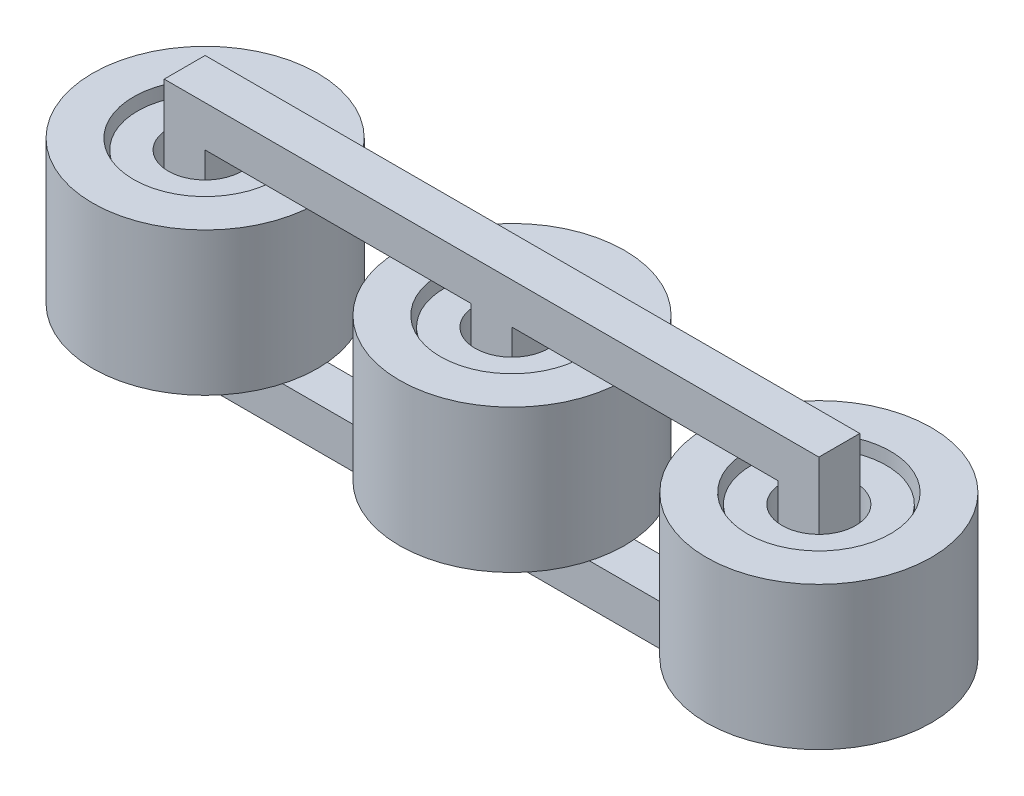
ISO-10303-21;
HEADER;
FILE_DESCRIPTION(('STEP AP214'),'2;1');
FILE_NAME('part.step','',(''),(''),'','','');
FILE_SCHEMA(('AUTOMOTIVE_DESIGN { 1 0 10303 214 1 1 1 1 }'));
ENDSEC;
DATA;
#1=APPLICATION_CONTEXT('core data for automotive mechanical design processes');
#2=APPLICATION_PROTOCOL_DEFINITION('international standard','automotive_design',2000,#1);
#3=PRODUCT_CONTEXT('',#1,'mechanical');
#4=PRODUCT('Part','Part','',(#3));
#5=PRODUCT_RELATED_PRODUCT_CATEGORY('part','',(#4));
#6=PRODUCT_DEFINITION_FORMATION('','',#4);
#7=PRODUCT_DEFINITION_CONTEXT('part definition',#1,'design');
#8=PRODUCT_DEFINITION('design','',#6,#7);
#9=PRODUCT_DEFINITION_SHAPE('','',#8);
#10=(LENGTH_UNIT() NAMED_UNIT(*) SI_UNIT(.MILLI.,.METRE.));
#11=(NAMED_UNIT(*) PLANE_ANGLE_UNIT() SI_UNIT($,.RADIAN.));
#12=(NAMED_UNIT(*) SI_UNIT($,.STERADIAN.) SOLID_ANGLE_UNIT());
#13=UNCERTAINTY_MEASURE_WITH_UNIT(LENGTH_MEASURE(1.E-05),#10,'distance_accuracy_value','');
#14=(GEOMETRIC_REPRESENTATION_CONTEXT(3) GLOBAL_UNCERTAINTY_ASSIGNED_CONTEXT((#13)) GLOBAL_UNIT_ASSIGNED_CONTEXT((#10,
#11,#12)) REPRESENTATION_CONTEXT('',''));
#15=CARTESIAN_POINT('',(0.,0.,0.));
#16=DIRECTION('',(0.,0.,1.));
#17=DIRECTION('',(1.,0.,0.));
#18=AXIS2_PLACEMENT_3D('',#15,#16,#17);
#19=CARTESIAN_POINT('',(1500.,717.900220009839,0.));
#20=DIRECTION('',(0.,1.,0.));
#21=DIRECTION('',(0.,0.,1.));
#22=AXIS2_PLACEMENT_3D('',#19,#20,#21);
#23=CYLINDRICAL_SURFACE('',#22,180.);
#24=CARTESIAN_POINT('',(1500.,-300.,0.));
#25=DIRECTION('',(0.,-1.,0.));
#26=DIRECTION('',(0.,0.,1.));
#27=AXIS2_PLACEMENT_3D('',#24,#25,#26);
#28=CIRCLE('',#27,180.);
#29=CARTESIAN_POINT('',(1500.,-300.,180.));
#30=VERTEX_POINT('',#29);
#31=EDGE_CURVE('E11',#30,#30,#28,.T.);
#32=ORIENTED_EDGE('',*,*,#31,.T.);
#33=EDGE_LOOP('',(#32));
#34=FACE_BOUND('',#33,.T.);
#35=CARTESIAN_POINT('',(1500.,300.,0.));
#36=DIRECTION('',(0.,-1.,0.));
#37=DIRECTION('',(0.,0.,1.));
#38=AXIS2_PLACEMENT_3D('',#35,#36,#37);
#39=CIRCLE('',#38,180.);
#40=CARTESIAN_POINT('',(1500.,300.,180.));
#41=VERTEX_POINT('',#40);
#42=EDGE_CURVE('E66',#41,#41,#39,.T.);
#43=ORIENTED_EDGE('',*,*,#42,.F.);
#44=EDGE_LOOP('',(#43));
#45=FACE_BOUND('',#44,.T.);
#46=ADVANCED_FACE('F52',(#34,#45),#23,.F.);
#47=CARTESIAN_POINT('',(1320.,-300.,0.));
#48=DIRECTION('',(0.,1.,0.));
#49=DIRECTION('',(0.,0.,1.));
#50=AXIS2_PLACEMENT_3D('',#47,#48,#49);
#51=PLANE('',#50);
#52=CARTESIAN_POINT('',(1500.,-300.,0.));
#53=DIRECTION('',(0.,-1.,0.));
#54=DIRECTION('',(0.,0.,1.));
#55=AXIS2_PLACEMENT_3D('',#52,#53,#54);
#56=CIRCLE('',#55,330.);
#57=CARTESIAN_POINT('',(1500.,-300.,330.));
#58=VERTEX_POINT('',#57);
#59=EDGE_CURVE('E58',#58,#58,#56,.T.);
#60=ORIENTED_EDGE('',*,*,#59,.T.);
#61=EDGE_LOOP('',(#60));
#62=FACE_BOUND('',#61,.T.);
#63=ORIENTED_EDGE('',*,*,#31,.F.);
#64=EDGE_LOOP('',(#63));
#65=FACE_BOUND('',#64,.T.);
#66=ADVANCED_FACE('F76',(#62,#65),#51,.F.);
#67=CARTESIAN_POINT('',(1500.,717.900220009839,0.));
#68=DIRECTION('',(0.,1.,0.));
#69=DIRECTION('',(0.,0.,1.));
#70=AXIS2_PLACEMENT_3D('',#67,#68,#69);
#71=CYLINDRICAL_SURFACE('',#70,330.);
#72=CARTESIAN_POINT('',(1500.,300.,0.));
#73=DIRECTION('',(0.,-1.,0.));
#74=DIRECTION('',(0.,0.,1.));
#75=AXIS2_PLACEMENT_3D('',#72,#73,#74);
#76=CIRCLE('',#75,330.);
#77=CARTESIAN_POINT('',(1500.,300.,330.));
#78=VERTEX_POINT('',#77);
#79=EDGE_CURVE('E62',#78,#78,#76,.T.);
#80=ORIENTED_EDGE('',*,*,#79,.T.);
#81=EDGE_LOOP('',(#80));
#82=FACE_BOUND('',#81,.T.);
#83=ORIENTED_EDGE('',*,*,#59,.F.);
#84=EDGE_LOOP('',(#83));
#85=FACE_BOUND('',#84,.T.);
#86=ADVANCED_FACE('F80',(#82,#85),#71,.T.);
#87=CARTESIAN_POINT('',(1320.,300.,0.));
#88=DIRECTION('',(0.,-1.,0.));
#89=DIRECTION('',(0.,0.,-1.));
#90=AXIS2_PLACEMENT_3D('',#87,#88,#89);
#91=PLANE('',#90);
#92=ORIENTED_EDGE('',*,*,#42,.T.);
#93=EDGE_LOOP('',(#92));
#94=FACE_BOUND('',#93,.T.);
#95=ORIENTED_EDGE('',*,*,#79,.F.);
#96=EDGE_LOOP('',(#95));
#97=FACE_BOUND('',#96,.T.);
#98=ADVANCED_FACE('F72',(#94,#97),#91,.F.);
#99=CLOSED_SHELL('',(#46,#66,#86,#98));
#100=MANIFOLD_SOLID_BREP('B2',#99);
#101=CARTESIAN_POINT('',(1500.,717.900220009839,0.));
#102=DIRECTION('',(0.,1.,0.));
#103=DIRECTION('',(0.,0.,1.));
#104=AXIS2_PLACEMENT_3D('',#101,#102,#103);
#105=CYLINDRICAL_SURFACE('',#104,350.);
#106=CARTESIAN_POINT('',(1500.,-350.,0.));
#107=DIRECTION('',(0.,-1.,0.));
#108=DIRECTION('',(0.,0.,1.));
#109=AXIS2_PLACEMENT_3D('',#106,#107,#108);
#110=CIRCLE('',#109,350.);
#111=CARTESIAN_POINT('',(1500.,-350.,350.));
#112=VERTEX_POINT('',#111);
#113=EDGE_CURVE('E51',#112,#112,#110,.T.);
#114=ORIENTED_EDGE('',*,*,#113,.T.);
#115=EDGE_LOOP('',(#114));
#116=FACE_BOUND('',#115,.T.);
#117=CARTESIAN_POINT('',(1500.,350.,0.));
#118=DIRECTION('',(0.,-1.,0.));
#119=DIRECTION('',(0.,0.,1.));
#120=AXIS2_PLACEMENT_3D('',#117,#118,#119);
#121=CIRCLE('',#120,350.);
#122=CARTESIAN_POINT('',(1500.,350.,350.));
#123=VERTEX_POINT('',#122);
#124=EDGE_CURVE('E160',#123,#123,#121,.T.);
#125=ORIENTED_EDGE('',*,*,#124,.F.);
#126=EDGE_LOOP('',(#125));
#127=FACE_BOUND('',#126,.T.);
#128=ADVANCED_FACE('F146',(#116,#127),#105,.F.);
#129=CARTESIAN_POINT('',(1150.,-350.,0.));
#130=DIRECTION('',(0.,1.,0.));
#131=DIRECTION('',(0.,0.,1.));
#132=AXIS2_PLACEMENT_3D('',#129,#130,#131);
#133=PLANE('',#132);
#134=CARTESIAN_POINT('',(1500.,-350.,0.));
#135=DIRECTION('',(0.,-1.,0.));
#136=DIRECTION('',(0.,0.,1.));
#137=AXIS2_PLACEMENT_3D('',#134,#135,#136);
#138=CIRCLE('',#137,550.);
#139=CARTESIAN_POINT('',(1500.,-350.,550.));
#140=VERTEX_POINT('',#139);
#141=EDGE_CURVE('E152',#140,#140,#138,.T.);
#142=ORIENTED_EDGE('',*,*,#141,.T.);
#143=EDGE_LOOP('',(#142));
#144=FACE_BOUND('',#143,.T.);
#145=ORIENTED_EDGE('',*,*,#113,.F.);
#146=EDGE_LOOP('',(#145));
#147=FACE_BOUND('',#146,.T.);
#148=ADVANCED_FACE('F170',(#144,#147),#133,.F.);
#149=CARTESIAN_POINT('',(1500.,717.900220009839,0.));
#150=DIRECTION('',(0.,1.,0.));
#151=DIRECTION('',(0.,0.,1.));
#152=AXIS2_PLACEMENT_3D('',#149,#150,#151);
#153=CYLINDRICAL_SURFACE('',#152,550.);
#154=CARTESIAN_POINT('',(1500.,350.,0.));
#155=DIRECTION('',(0.,-1.,0.));
#156=DIRECTION('',(0.,0.,1.));
#157=AXIS2_PLACEMENT_3D('',#154,#155,#156);
#158=CIRCLE('',#157,550.);
#159=CARTESIAN_POINT('',(1500.,350.,550.));
#160=VERTEX_POINT('',#159);
#161=EDGE_CURVE('E156',#160,#160,#158,.T.);
#162=ORIENTED_EDGE('',*,*,#161,.T.);
#163=EDGE_LOOP('',(#162));
#164=FACE_BOUND('',#163,.T.);
#165=ORIENTED_EDGE('',*,*,#141,.F.);
#166=EDGE_LOOP('',(#165));
#167=FACE_BOUND('',#166,.T.);
#168=ADVANCED_FACE('F174',(#164,#167),#153,.T.);
#169=CARTESIAN_POINT('',(1150.,350.,0.));
#170=DIRECTION('',(0.,-1.,0.));
#171=DIRECTION('',(0.,0.,-1.));
#172=AXIS2_PLACEMENT_3D('',#169,#170,#171);
#173=PLANE('',#172);
#174=ORIENTED_EDGE('',*,*,#124,.T.);
#175=EDGE_LOOP('',(#174));
#176=FACE_BOUND('',#175,.T.);
#177=ORIENTED_EDGE('',*,*,#161,.F.);
#178=EDGE_LOOP('',(#177));
#179=FACE_BOUND('',#178,.T.);
#180=ADVANCED_FACE('F166',(#176,#179),#173,.F.);
#181=CLOSED_SHELL('',(#128,#148,#168,#180));
#182=MANIFOLD_SOLID_BREP('B6',#181);
#183=CARTESIAN_POINT('',(-1500.,717.900220009839,0.));
#184=DIRECTION('',(0.,1.,0.));
#185=DIRECTION('',(0.,0.,1.));
#186=AXIS2_PLACEMENT_3D('',#183,#184,#185);
#187=CYLINDRICAL_SURFACE('',#186,350.);
#188=CARTESIAN_POINT('',(-1500.,-350.,0.));
#189=DIRECTION('',(0.,1.,0.));
#190=DIRECTION('',(0.,0.,1.));
#191=AXIS2_PLACEMENT_3D('',#188,#189,#190);
#192=CIRCLE('',#191,350.);
#193=CARTESIAN_POINT('',(-1500.,-350.,350.));
#194=VERTEX_POINT('',#193);
#195=EDGE_CURVE('E145',#194,#194,#192,.T.);
#196=ORIENTED_EDGE('',*,*,#195,.F.);
#197=EDGE_LOOP('',(#196));
#198=FACE_BOUND('',#197,.T.);
#199=CARTESIAN_POINT('',(-1500.,350.,0.));
#200=DIRECTION('',(0.,1.,0.));
#201=DIRECTION('',(0.,0.,1.));
#202=AXIS2_PLACEMENT_3D('',#199,#200,#201);
#203=CIRCLE('',#202,350.);
#204=CARTESIAN_POINT('',(-1500.,350.,350.));
#205=VERTEX_POINT('',#204);
#206=EDGE_CURVE('E254',#205,#205,#203,.T.);
#207=ORIENTED_EDGE('',*,*,#206,.T.);
#208=EDGE_LOOP('',(#207));
#209=FACE_BOUND('',#208,.T.);
#210=ADVANCED_FACE('F240',(#198,#209),#187,.F.);
#211=CARTESIAN_POINT('',(-1150.,-350.,0.));
#212=DIRECTION('',(0.,1.,0.));
#213=DIRECTION('',(0.,0.,1.));
#214=AXIS2_PLACEMENT_3D('',#211,#212,#213);
#215=PLANE('',#214);
#216=CARTESIAN_POINT('',(-1500.,-350.,0.));
#217=DIRECTION('',(0.,1.,0.));
#218=DIRECTION('',(0.,0.,1.));
#219=AXIS2_PLACEMENT_3D('',#216,#217,#218);
#220=CIRCLE('',#219,550.);
#221=CARTESIAN_POINT('',(-1500.,-350.,550.));
#222=VERTEX_POINT('',#221);
#223=EDGE_CURVE('E246',#222,#222,#220,.T.);
#224=ORIENTED_EDGE('',*,*,#223,.F.);
#225=EDGE_LOOP('',(#224));
#226=FACE_BOUND('',#225,.T.);
#227=ORIENTED_EDGE('',*,*,#195,.T.);
#228=EDGE_LOOP('',(#227));
#229=FACE_BOUND('',#228,.T.);
#230=ADVANCED_FACE('F269',(#226,#229),#215,.F.);
#231=CARTESIAN_POINT('',(-1500.,717.900220009839,0.));
#232=DIRECTION('',(0.,1.,0.));
#233=DIRECTION('',(0.,0.,1.));
#234=AXIS2_PLACEMENT_3D('',#231,#232,#233);
#235=CYLINDRICAL_SURFACE('',#234,550.);
#236=CARTESIAN_POINT('',(-1500.,350.,0.));
#237=DIRECTION('',(0.,1.,0.));
#238=DIRECTION('',(0.,0.,1.));
#239=AXIS2_PLACEMENT_3D('',#236,#237,#238);
#240=CIRCLE('',#239,550.);
#241=CARTESIAN_POINT('',(-1500.,350.,550.));
#242=VERTEX_POINT('',#241);
#243=EDGE_CURVE('E250',#242,#242,#240,.T.);
#244=ORIENTED_EDGE('',*,*,#243,.F.);
#245=EDGE_LOOP('',(#244));
#246=FACE_BOUND('',#245,.T.);
#247=ORIENTED_EDGE('',*,*,#223,.T.);
#248=EDGE_LOOP('',(#247));
#249=FACE_BOUND('',#248,.T.);
#250=ADVANCED_FACE('F264',(#246,#249),#235,.T.);
#251=CARTESIAN_POINT('',(-1150.,350.,0.));
#252=DIRECTION('',(0.,-1.,0.));
#253=DIRECTION('',(0.,0.,-1.));
#254=AXIS2_PLACEMENT_3D('',#251,#252,#253);
#255=PLANE('',#254);
#256=ORIENTED_EDGE('',*,*,#206,.F.);
#257=EDGE_LOOP('',(#256));
#258=FACE_BOUND('',#257,.T.);
#259=ORIENTED_EDGE('',*,*,#243,.T.);
#260=EDGE_LOOP('',(#259));
#261=FACE_BOUND('',#260,.T.);
#262=ADVANCED_FACE('F261',(#258,#261),#255,.F.);
#263=CLOSED_SHELL('',(#210,#230,#250,#262));
#264=MANIFOLD_SOLID_BREP('B46',#263);
#265=CARTESIAN_POINT('',(-1500.,717.900220009839,0.));
#266=DIRECTION('',(0.,1.,0.));
#267=DIRECTION('',(0.,0.,1.));
#268=AXIS2_PLACEMENT_3D('',#265,#266,#267);
#269=CYLINDRICAL_SURFACE('',#268,180.);
#270=CARTESIAN_POINT('',(-1500.,-300.,0.));
#271=DIRECTION('',(0.,1.,0.));
#272=DIRECTION('',(0.,0.,1.));
#273=AXIS2_PLACEMENT_3D('',#270,#271,#272);
#274=CIRCLE('',#273,180.);
#275=CARTESIAN_POINT('',(-1500.,-300.,180.));
#276=VERTEX_POINT('',#275);
#277=EDGE_CURVE('E239',#276,#276,#274,.T.);
#278=ORIENTED_EDGE('',*,*,#277,.F.);
#279=EDGE_LOOP('',(#278));
#280=FACE_BOUND('',#279,.T.);
#281=CARTESIAN_POINT('',(-1500.,300.,0.));
#282=DIRECTION('',(0.,1.,0.));
#283=DIRECTION('',(0.,0.,1.));
#284=AXIS2_PLACEMENT_3D('',#281,#282,#283);
#285=CIRCLE('',#284,180.);
#286=CARTESIAN_POINT('',(-1500.,300.,180.));
#287=VERTEX_POINT('',#286);
#288=EDGE_CURVE('E348',#287,#287,#285,.T.);
#289=ORIENTED_EDGE('',*,*,#288,.T.);
#290=EDGE_LOOP('',(#289));
#291=FACE_BOUND('',#290,.T.);
#292=ADVANCED_FACE('F334',(#280,#291),#269,.F.);
#293=CARTESIAN_POINT('',(-1320.,-300.,0.));
#294=DIRECTION('',(0.,1.,0.));
#295=DIRECTION('',(0.,0.,1.));
#296=AXIS2_PLACEMENT_3D('',#293,#294,#295);
#297=PLANE('',#296);
#298=CARTESIAN_POINT('',(-1500.,-300.,0.));
#299=DIRECTION('',(0.,1.,0.));
#300=DIRECTION('',(0.,0.,1.));
#301=AXIS2_PLACEMENT_3D('',#298,#299,#300);
#302=CIRCLE('',#301,330.);
#303=CARTESIAN_POINT('',(-1500.,-300.,330.));
#304=VERTEX_POINT('',#303);
#305=EDGE_CURVE('E340',#304,#304,#302,.T.);
#306=ORIENTED_EDGE('',*,*,#305,.F.);
#307=EDGE_LOOP('',(#306));
#308=FACE_BOUND('',#307,.T.);
#309=ORIENTED_EDGE('',*,*,#277,.T.);
#310=EDGE_LOOP('',(#309));
#311=FACE_BOUND('',#310,.T.);
#312=ADVANCED_FACE('F363',(#308,#311),#297,.F.);
#313=CARTESIAN_POINT('',(-1500.,717.900220009839,0.));
#314=DIRECTION('',(0.,1.,0.));
#315=DIRECTION('',(0.,0.,1.));
#316=AXIS2_PLACEMENT_3D('',#313,#314,#315);
#317=CYLINDRICAL_SURFACE('',#316,330.);
#318=CARTESIAN_POINT('',(-1500.,300.,0.));
#319=DIRECTION('',(0.,1.,0.));
#320=DIRECTION('',(0.,0.,1.));
#321=AXIS2_PLACEMENT_3D('',#318,#319,#320);
#322=CIRCLE('',#321,330.);
#323=CARTESIAN_POINT('',(-1500.,300.,330.));
#324=VERTEX_POINT('',#323);
#325=EDGE_CURVE('E344',#324,#324,#322,.T.);
#326=ORIENTED_EDGE('',*,*,#325,.F.);
#327=EDGE_LOOP('',(#326));
#328=FACE_BOUND('',#327,.T.);
#329=ORIENTED_EDGE('',*,*,#305,.T.);
#330=EDGE_LOOP('',(#329));
#331=FACE_BOUND('',#330,.T.);
#332=ADVANCED_FACE('F358',(#328,#331),#317,.T.);
#333=CARTESIAN_POINT('',(-1320.,300.,0.));
#334=DIRECTION('',(0.,-1.,0.));
#335=DIRECTION('',(0.,0.,-1.));
#336=AXIS2_PLACEMENT_3D('',#333,#334,#335);
#337=PLANE('',#336);
#338=ORIENTED_EDGE('',*,*,#288,.F.);
#339=EDGE_LOOP('',(#338));
#340=FACE_BOUND('',#339,.T.);
#341=ORIENTED_EDGE('',*,*,#325,.T.);
#342=EDGE_LOOP('',(#341));
#343=FACE_BOUND('',#342,.T.);
#344=ADVANCED_FACE('F355',(#340,#343),#337,.F.);
#345=CLOSED_SHELL('',(#292,#312,#332,#344));
#346=MANIFOLD_SOLID_BREP('B140',#345);
#347=CARTESIAN_POINT('',(0.,717.900220009839,0.));
#348=DIRECTION('',(0.,1.,0.));
#349=DIRECTION('',(0.,0.,1.));
#350=AXIS2_PLACEMENT_3D('',#347,#348,#349);
#351=CYLINDRICAL_SURFACE('',#350,350.);
#352=CARTESIAN_POINT('',(0.,-350.,0.));
#353=DIRECTION('',(0.,1.,0.));
#354=DIRECTION('',(0.,0.,1.));
#355=AXIS2_PLACEMENT_3D('',#352,#353,#354);
#356=CIRCLE('',#355,350.);
#357=CARTESIAN_POINT('',(0.,-350.,350.));
#358=VERTEX_POINT('',#357);
#359=EDGE_CURVE('E333',#358,#358,#356,.T.);
#360=ORIENTED_EDGE('',*,*,#359,.F.);
#361=EDGE_LOOP('',(#360));
#362=FACE_BOUND('',#361,.T.);
#363=CARTESIAN_POINT('',(0.,350.,0.));
#364=DIRECTION('',(0.,1.,0.));
#365=DIRECTION('',(0.,0.,1.));
#366=AXIS2_PLACEMENT_3D('',#363,#364,#365);
#367=CIRCLE('',#366,350.);
#368=CARTESIAN_POINT('',(0.,350.,350.));
#369=VERTEX_POINT('',#368);
#370=EDGE_CURVE('E442',#369,#369,#367,.T.);
#371=ORIENTED_EDGE('',*,*,#370,.T.);
#372=EDGE_LOOP('',(#371));
#373=FACE_BOUND('',#372,.T.);
#374=ADVANCED_FACE('F428',(#362,#373),#351,.F.);
#375=CARTESIAN_POINT('',(350.,-350.,0.));
#376=DIRECTION('',(0.,1.,0.));
#377=DIRECTION('',(0.,0.,1.));
#378=AXIS2_PLACEMENT_3D('',#375,#376,#377);
#379=PLANE('',#378);
#380=CARTESIAN_POINT('',(0.,-350.,0.));
#381=DIRECTION('',(0.,1.,0.));
#382=DIRECTION('',(0.,0.,1.));
#383=AXIS2_PLACEMENT_3D('',#380,#381,#382);
#384=CIRCLE('',#383,550.);
#385=CARTESIAN_POINT('',(0.,-350.,550.));
#386=VERTEX_POINT('',#385);
#387=EDGE_CURVE('E434',#386,#386,#384,.T.);
#388=ORIENTED_EDGE('',*,*,#387,.F.);
#389=EDGE_LOOP('',(#388));
#390=FACE_BOUND('',#389,.T.);
#391=ORIENTED_EDGE('',*,*,#359,.T.);
#392=EDGE_LOOP('',(#391));
#393=FACE_BOUND('',#392,.T.);
#394=ADVANCED_FACE('F457',(#390,#393),#379,.F.);
#395=CARTESIAN_POINT('',(0.,717.900220009839,0.));
#396=DIRECTION('',(0.,1.,0.));
#397=DIRECTION('',(0.,0.,1.));
#398=AXIS2_PLACEMENT_3D('',#395,#396,#397);
#399=CYLINDRICAL_SURFACE('',#398,550.);
#400=CARTESIAN_POINT('',(0.,350.,0.));
#401=DIRECTION('',(0.,1.,0.));
#402=DIRECTION('',(0.,0.,1.));
#403=AXIS2_PLACEMENT_3D('',#400,#401,#402);
#404=CIRCLE('',#403,550.);
#405=CARTESIAN_POINT('',(0.,350.,550.));
#406=VERTEX_POINT('',#405);
#407=EDGE_CURVE('E438',#406,#406,#404,.T.);
#408=ORIENTED_EDGE('',*,*,#407,.F.);
#409=EDGE_LOOP('',(#408));
#410=FACE_BOUND('',#409,.T.);
#411=ORIENTED_EDGE('',*,*,#387,.T.);
#412=EDGE_LOOP('',(#411));
#413=FACE_BOUND('',#412,.T.);
#414=ADVANCED_FACE('F452',(#410,#413),#399,.T.);
#415=CARTESIAN_POINT('',(350.,350.,0.));
#416=DIRECTION('',(0.,-1.,0.));
#417=DIRECTION('',(0.,0.,-1.));
#418=AXIS2_PLACEMENT_3D('',#415,#416,#417);
#419=PLANE('',#418);
#420=ORIENTED_EDGE('',*,*,#370,.F.);
#421=EDGE_LOOP('',(#420));
#422=FACE_BOUND('',#421,.T.);
#423=ORIENTED_EDGE('',*,*,#407,.T.);
#424=EDGE_LOOP('',(#423));
#425=FACE_BOUND('',#424,.T.);
#426=ADVANCED_FACE('F449',(#422,#425),#419,.F.);
#427=CLOSED_SHELL('',(#374,#394,#414,#426));
#428=MANIFOLD_SOLID_BREP('B234',#427);
#429=CARTESIAN_POINT('',(0.,717.900220009839,0.));
#430=DIRECTION('',(0.,1.,0.));
#431=DIRECTION('',(0.,0.,1.));
#432=AXIS2_PLACEMENT_3D('',#429,#430,#431);
#433=CYLINDRICAL_SURFACE('',#432,180.);
#434=CARTESIAN_POINT('',(0.,-300.,0.));
#435=DIRECTION('',(0.,1.,0.));
#436=DIRECTION('',(0.,0.,1.));
#437=AXIS2_PLACEMENT_3D('',#434,#435,#436);
#438=CIRCLE('',#437,180.);
#439=CARTESIAN_POINT('',(0.,-300.,180.));
#440=VERTEX_POINT('',#439);
#441=EDGE_CURVE('E427',#440,#440,#438,.T.);
#442=ORIENTED_EDGE('',*,*,#441,.F.);
#443=EDGE_LOOP('',(#442));
#444=FACE_BOUND('',#443,.T.);
#445=CARTESIAN_POINT('',(0.,300.,0.));
#446=DIRECTION('',(0.,1.,0.));
#447=DIRECTION('',(0.,0.,1.));
#448=AXIS2_PLACEMENT_3D('',#445,#446,#447);
#449=CIRCLE('',#448,180.);
#450=CARTESIAN_POINT('',(0.,300.,180.));
#451=VERTEX_POINT('',#450);
#452=EDGE_CURVE('E529',#451,#451,#449,.T.);
#453=ORIENTED_EDGE('',*,*,#452,.T.);
#454=EDGE_LOOP('',(#453));
#455=FACE_BOUND('',#454,.T.);
#456=ADVANCED_FACE('F515',(#444,#455),#433,.F.);
#457=CARTESIAN_POINT('',(180.,-300.,0.));
#458=DIRECTION('',(0.,1.,0.));
#459=DIRECTION('',(0.,0.,1.));
#460=AXIS2_PLACEMENT_3D('',#457,#458,#459);
#461=PLANE('',#460);
#462=CARTESIAN_POINT('',(0.,-300.,0.));
#463=DIRECTION('',(0.,1.,0.));
#464=DIRECTION('',(0.,0.,1.));
#465=AXIS2_PLACEMENT_3D('',#462,#463,#464);
#466=CIRCLE('',#465,330.);
#467=CARTESIAN_POINT('',(0.,-300.,330.));
#468=VERTEX_POINT('',#467);
#469=EDGE_CURVE('E521',#468,#468,#466,.T.);
#470=ORIENTED_EDGE('',*,*,#469,.F.);
#471=EDGE_LOOP('',(#470));
#472=FACE_BOUND('',#471,.T.);
#473=ORIENTED_EDGE('',*,*,#441,.T.);
#474=EDGE_LOOP('',(#473));
#475=FACE_BOUND('',#474,.T.);
#476=ADVANCED_FACE('F544',(#472,#475),#461,.F.);
#477=CARTESIAN_POINT('',(0.,717.900220009839,0.));
#478=DIRECTION('',(0.,1.,0.));
#479=DIRECTION('',(0.,0.,1.));
#480=AXIS2_PLACEMENT_3D('',#477,#478,#479);
#481=CYLINDRICAL_SURFACE('',#480,330.);
#482=CARTESIAN_POINT('',(0.,300.,0.));
#483=DIRECTION('',(0.,1.,0.));
#484=DIRECTION('',(0.,0.,1.));
#485=AXIS2_PLACEMENT_3D('',#482,#483,#484);
#486=CIRCLE('',#485,330.);
#487=CARTESIAN_POINT('',(0.,300.,330.));
#488=VERTEX_POINT('',#487);
#489=EDGE_CURVE('E525',#488,#488,#486,.T.);
#490=ORIENTED_EDGE('',*,*,#489,.F.);
#491=EDGE_LOOP('',(#490));
#492=FACE_BOUND('',#491,.T.);
#493=ORIENTED_EDGE('',*,*,#469,.T.);
#494=EDGE_LOOP('',(#493));
#495=FACE_BOUND('',#494,.T.);
#496=ADVANCED_FACE('F539',(#492,#495),#481,.T.);
#497=CARTESIAN_POINT('',(180.,300.,0.));
#498=DIRECTION('',(0.,-1.,0.));
#499=DIRECTION('',(0.,0.,-1.));
#500=AXIS2_PLACEMENT_3D('',#497,#498,#499);
#501=PLANE('',#500);
#502=ORIENTED_EDGE('',*,*,#452,.F.);
#503=EDGE_LOOP('',(#502));
#504=FACE_BOUND('',#503,.T.);
#505=ORIENTED_EDGE('',*,*,#489,.T.);
#506=EDGE_LOOP('',(#505));
#507=FACE_BOUND('',#506,.T.);
#508=ADVANCED_FACE('F536',(#504,#507),#501,.F.);
#509=CLOSED_SHELL('',(#456,#476,#496,#508));
#510=MANIFOLD_SOLID_BREP('B328',#509);
#511=CARTESIAN_POINT('',(100.,600.,100.));
#512=DIRECTION('',(-1.,0.,0.));
#513=DIRECTION('',(0.,-1.,0.));
#514=AXIS2_PLACEMENT_3D('',#511,#512,#513);
#515=PLANE('',#514);
#516=DIRECTION('',(0.,0.,-1.));
#517=VECTOR('',#516,1.);
#518=CARTESIAN_POINT('',(100.,400.,100.));
#519=LINE('',#518,#517);
#520=CARTESIAN_POINT('',(100.,400.,100.));
#521=VERTEX_POINT('',#520);
#522=CARTESIAN_POINT('',(100.,400.,-100.));
#523=VERTEX_POINT('',#522);
#524=EDGE_CURVE('E608',#521,#523,#519,.T.);
#525=ORIENTED_EDGE('',*,*,#524,.F.);
#526=DIRECTION('',(0.,1.,0.));
#527=VECTOR('',#526,1.);
#528=CARTESIAN_POINT('',(100.,600.,100.));
#529=LINE('',#528,#527);
#530=CARTESIAN_POINT('',(100.,-400.,100.));
#531=VERTEX_POINT('',#530);
#532=EDGE_CURVE('E703',#531,#521,#529,.T.);
#533=ORIENTED_EDGE('',*,*,#532,.F.);
#534=DIRECTION('',(0.,0.,-1.));
#535=VECTOR('',#534,1.);
#536=CARTESIAN_POINT('',(100.,-400.,100.));
#537=LINE('',#536,#535);
#538=CARTESIAN_POINT('',(100.,-400.,-100.));
#539=VERTEX_POINT('',#538);
#540=EDGE_CURVE('E613',#531,#539,#537,.T.);
#541=ORIENTED_EDGE('',*,*,#540,.T.);
#542=DIRECTION('',(0.,1.,0.));
#543=VECTOR('',#542,1.);
#544=CARTESIAN_POINT('',(100.,600.,-100.));
#545=LINE('',#544,#543);
#546=EDGE_CURVE('E772',#539,#523,#545,.T.);
#547=ORIENTED_EDGE('',*,*,#546,.T.);
#548=EDGE_LOOP('',(#525,#533,#541,#547));
#549=FACE_BOUND('',#548,.T.);
#550=ADVANCED_FACE('F593',(#549),#515,.F.);
#551=CARTESIAN_POINT('',(0.,0.,100.));
#552=DIRECTION('',(0.,0.,1.));
#553=DIRECTION('',(1.,0.,0.));
#554=AXIS2_PLACEMENT_3D('',#551,#552,#553);
#555=PLANE('',#554);
#556=DIRECTION('',(-1.,0.,0.));
#557=VECTOR('',#556,1.);
#558=CARTESIAN_POINT('',(-1400.,400.,100.));
#559=LINE('',#558,#557);
#560=CARTESIAN_POINT('',(-100.,400.,100.));
#561=VERTEX_POINT('',#560);
#562=CARTESIAN_POINT('',(-1400.,400.,100.));
#563=VERTEX_POINT('',#562);
#564=EDGE_CURVE('E736',#561,#563,#559,.T.);
#565=ORIENTED_EDGE('',*,*,#564,.F.);
#566=DIRECTION('',(0.,1.,0.));
#567=VECTOR('',#566,1.);
#568=CARTESIAN_POINT('',(-100.,400.,100.));
#569=LINE('',#568,#567);
#570=CARTESIAN_POINT('',(-100.,-400.,100.));
#571=VERTEX_POINT('',#570);
#572=EDGE_CURVE('E733',#571,#561,#569,.T.);
#573=ORIENTED_EDGE('',*,*,#572,.F.);
#574=DIRECTION('',(1.,0.,0.));
#575=VECTOR('',#574,1.);
#576=CARTESIAN_POINT('',(-1400.,-400.,100.));
#577=LINE('',#576,#575);
#578=CARTESIAN_POINT('',(-1400.,-400.,100.));
#579=VERTEX_POINT('',#578);
#580=EDGE_CURVE('E730',#579,#571,#577,.T.);
#581=ORIENTED_EDGE('',*,*,#580,.F.);
#582=DIRECTION('',(0.,-1.,0.));
#583=VECTOR('',#582,1.);
#584=CARTESIAN_POINT('',(-1400.,400.,100.));
#585=LINE('',#584,#583);
#586=EDGE_CURVE('E728',#563,#579,#585,.T.);
#587=ORIENTED_EDGE('',*,*,#586,.F.);
#588=EDGE_LOOP('',(#565,#573,#581,#587));
#589=FACE_BOUND('',#588,.T.);
#590=DIRECTION('',(-1.,0.,0.));
#591=VECTOR('',#590,1.);
#592=CARTESIAN_POINT('',(-1600.,600.,100.));
#593=LINE('',#592,#591);
#594=CARTESIAN_POINT('',(1600.,600.,100.));
#595=VERTEX_POINT('',#594);
#596=CARTESIAN_POINT('',(-1600.,600.,100.));
#597=VERTEX_POINT('',#596);
#598=EDGE_CURVE('E766',#595,#597,#593,.T.);
#599=ORIENTED_EDGE('',*,*,#598,.T.);
#600=DIRECTION('',(0.,-1.,0.));
#601=VECTOR('',#600,1.);
#602=CARTESIAN_POINT('',(-1600.,600.,100.));
#603=LINE('',#602,#601);
#604=CARTESIAN_POINT('',(-1600.,-600.,100.));
#605=VERTEX_POINT('',#604);
#606=EDGE_CURVE('E759',#597,#605,#603,.T.);
#607=ORIENTED_EDGE('',*,*,#606,.T.);
#608=DIRECTION('',(1.,0.,0.));
#609=VECTOR('',#608,1.);
#610=CARTESIAN_POINT('',(-1600.,-600.,100.));
#611=LINE('',#610,#609);
#612=CARTESIAN_POINT('',(1600.,-600.,100.));
#613=VERTEX_POINT('',#612);
#614=EDGE_CURVE('E762',#605,#613,#611,.T.);
#615=ORIENTED_EDGE('',*,*,#614,.T.);
#616=DIRECTION('',(0.,-1.,0.));
#617=VECTOR('',#616,1.);
#618=CARTESIAN_POINT('',(1600.,600.,100.));
#619=LINE('',#618,#617);
#620=EDGE_CURVE('E716',#595,#613,#619,.T.);
#621=ORIENTED_EDGE('',*,*,#620,.F.);
#622=EDGE_LOOP('',(#599,#607,#615,#621));
#623=FACE_BOUND('',#622,.T.);
#624=DIRECTION('',(-1.,0.,0.));
#625=VECTOR('',#624,1.);
#626=CARTESIAN_POINT('',(1400.,-400.,100.));
#627=LINE('',#626,#625);
#628=CARTESIAN_POINT('',(1400.,-400.,100.));
#629=VERTEX_POINT('',#628);
#630=EDGE_CURVE('E704',#629,#531,#627,.T.);
#631=ORIENTED_EDGE('',*,*,#630,.T.);
#632=ORIENTED_EDGE('',*,*,#532,.T.);
#633=DIRECTION('',(1.,0.,0.));
#634=VECTOR('',#633,1.);
#635=CARTESIAN_POINT('',(1400.,400.,100.));
#636=LINE('',#635,#634);
#637=CARTESIAN_POINT('',(1400.,400.,100.));
#638=VERTEX_POINT('',#637);
#639=EDGE_CURVE('E685',#521,#638,#636,.T.);
#640=ORIENTED_EDGE('',*,*,#639,.T.);
#641=DIRECTION('',(0.,-1.,0.));
#642=VECTOR('',#641,1.);
#643=CARTESIAN_POINT('',(1400.,400.,100.));
#644=LINE('',#643,#642);
#645=EDGE_CURVE('E693',#638,#629,#644,.T.);
#646=ORIENTED_EDGE('',*,*,#645,.T.);
#647=EDGE_LOOP('',(#631,#632,#640,#646));
#648=FACE_BOUND('',#647,.T.);
#649=ADVANCED_FACE('F702',(#589,#623,#648),#555,.T.);
#650=CARTESIAN_POINT('',(0.,0.,-100.));
#651=DIRECTION('',(0.,0.,1.));
#652=DIRECTION('',(1.,0.,0.));
#653=AXIS2_PLACEMENT_3D('',#650,#651,#652);
#654=PLANE('',#653);
#655=DIRECTION('',(0.,1.,0.));
#656=VECTOR('',#655,1.);
#657=CARTESIAN_POINT('',(-100.,400.,-100.));
#658=LINE('',#657,#656);
#659=CARTESIAN_POINT('',(-100.,-400.,-100.));
#660=VERTEX_POINT('',#659);
#661=CARTESIAN_POINT('',(-100.,400.,-100.));
#662=VERTEX_POINT('',#661);
#663=EDGE_CURVE('E744',#660,#662,#658,.T.);
#664=ORIENTED_EDGE('',*,*,#663,.T.);
#665=DIRECTION('',(-1.,0.,0.));
#666=VECTOR('',#665,1.);
#667=CARTESIAN_POINT('',(-1400.,400.,-100.));
#668=LINE('',#667,#666);
#669=CARTESIAN_POINT('',(-1400.,400.,-100.));
#670=VERTEX_POINT('',#669);
#671=EDGE_CURVE('E731',#662,#670,#668,.T.);
#672=ORIENTED_EDGE('',*,*,#671,.T.);
#673=DIRECTION('',(0.,-1.,0.));
#674=VECTOR('',#673,1.);
#675=CARTESIAN_POINT('',(-1400.,400.,-100.));
#676=LINE('',#675,#674);
#677=CARTESIAN_POINT('',(-1400.,-400.,-100.));
#678=VERTEX_POINT('',#677);
#679=EDGE_CURVE('E727',#670,#678,#676,.T.);
#680=ORIENTED_EDGE('',*,*,#679,.T.);
#681=DIRECTION('',(1.,0.,0.));
#682=VECTOR('',#681,1.);
#683=CARTESIAN_POINT('',(-1400.,-400.,-100.));
#684=LINE('',#683,#682);
#685=EDGE_CURVE('E741',#678,#660,#684,.T.);
#686=ORIENTED_EDGE('',*,*,#685,.T.);
#687=EDGE_LOOP('',(#664,#672,#680,#686));
#688=FACE_BOUND('',#687,.T.);
#689=DIRECTION('',(0.,-1.,0.));
#690=VECTOR('',#689,1.);
#691=CARTESIAN_POINT('',(-1600.,600.,-100.));
#692=LINE('',#691,#690);
#693=CARTESIAN_POINT('',(-1600.,600.,-100.));
#694=VERTEX_POINT('',#693);
#695=CARTESIAN_POINT('',(-1600.,-600.,-100.));
#696=VERTEX_POINT('',#695);
#697=EDGE_CURVE('E758',#694,#696,#692,.T.);
#698=ORIENTED_EDGE('',*,*,#697,.F.);
#699=DIRECTION('',(-1.,0.,0.));
#700=VECTOR('',#699,1.);
#701=CARTESIAN_POINT('',(-1600.,600.,-100.));
#702=LINE('',#701,#700);
#703=CARTESIAN_POINT('',(1600.,600.,-100.));
#704=VERTEX_POINT('',#703);
#705=EDGE_CURVE('E763',#704,#694,#702,.T.);
#706=ORIENTED_EDGE('',*,*,#705,.F.);
#707=DIRECTION('',(0.,-1.,0.));
#708=VECTOR('',#707,1.);
#709=CARTESIAN_POINT('',(1600.,600.,-100.));
#710=LINE('',#709,#708);
#711=CARTESIAN_POINT('',(1600.,-600.,-100.));
#712=VERTEX_POINT('',#711);
#713=EDGE_CURVE('E690',#704,#712,#710,.T.);
#714=ORIENTED_EDGE('',*,*,#713,.T.);
#715=DIRECTION('',(1.,0.,0.));
#716=VECTOR('',#715,1.);
#717=CARTESIAN_POINT('',(-1600.,-600.,-100.));
#718=LINE('',#717,#716);
#719=EDGE_CURVE('E770',#696,#712,#718,.T.);
#720=ORIENTED_EDGE('',*,*,#719,.F.);
#721=EDGE_LOOP('',(#698,#706,#714,#720));
#722=FACE_BOUND('',#721,.T.);
#723=ORIENTED_EDGE('',*,*,#546,.F.);
#724=DIRECTION('',(-1.,0.,0.));
#725=VECTOR('',#724,1.);
#726=CARTESIAN_POINT('',(1400.,-400.,-100.));
#727=LINE('',#726,#725);
#728=CARTESIAN_POINT('',(1400.,-400.,-100.));
#729=VERTEX_POINT('',#728);
#730=EDGE_CURVE('E700',#729,#539,#727,.T.);
#731=ORIENTED_EDGE('',*,*,#730,.F.);
#732=DIRECTION('',(0.,-1.,0.));
#733=VECTOR('',#732,1.);
#734=CARTESIAN_POINT('',(1400.,400.,-100.));
#735=LINE('',#734,#733);
#736=CARTESIAN_POINT('',(1400.,400.,-100.));
#737=VERTEX_POINT('',#736);
#738=EDGE_CURVE('E708',#737,#729,#735,.T.);
#739=ORIENTED_EDGE('',*,*,#738,.F.);
#740=DIRECTION('',(1.,0.,0.));
#741=VECTOR('',#740,1.);
#742=CARTESIAN_POINT('',(1400.,400.,-100.));
#743=LINE('',#742,#741);
#744=EDGE_CURVE('E687',#523,#737,#743,.T.);
#745=ORIENTED_EDGE('',*,*,#744,.F.);
#746=EDGE_LOOP('',(#723,#731,#739,#745));
#747=FACE_BOUND('',#746,.T.);
#748=ADVANCED_FACE('F782',(#688,#722,#747),#654,.F.);
#749=CARTESIAN_POINT('',(-1600.,600.,100.));
#750=DIRECTION('',(1.,0.,0.));
#751=DIRECTION('',(0.,0.,-1.));
#752=AXIS2_PLACEMENT_3D('',#749,#750,#751);
#753=PLANE('',#752);
#754=ORIENTED_EDGE('',*,*,#697,.T.);
#755=DIRECTION('',(0.,0.,-1.));
#756=VECTOR('',#755,1.);
#757=CARTESIAN_POINT('',(-1600.,-600.,100.));
#758=LINE('',#757,#756);
#759=EDGE_CURVE('E513',#605,#696,#758,.T.);
#760=ORIENTED_EDGE('',*,*,#759,.F.);
#761=ORIENTED_EDGE('',*,*,#606,.F.);
#762=DIRECTION('',(0.,0.,-1.));
#763=VECTOR('',#762,1.);
#764=CARTESIAN_POINT('',(-1600.,600.,100.));
#765=LINE('',#764,#763);
#766=EDGE_CURVE('E601',#597,#694,#765,.T.);
#767=ORIENTED_EDGE('',*,*,#766,.T.);
#768=EDGE_LOOP('',(#754,#760,#761,#767));
#769=FACE_BOUND('',#768,.T.);
#770=ADVANCED_FACE('F595',(#769),#753,.F.);
#771=CARTESIAN_POINT('',(-1600.,-600.,100.));
#772=DIRECTION('',(0.,1.,0.));
#773=DIRECTION('',(-1.,0.,0.));
#774=AXIS2_PLACEMENT_3D('',#771,#772,#773);
#775=PLANE('',#774);
#776=ORIENTED_EDGE('',*,*,#719,.T.);
#777=DIRECTION('',(0.,0.,-1.));
#778=VECTOR('',#777,1.);
#779=CARTESIAN_POINT('',(1600.,-600.,100.));
#780=LINE('',#779,#778);
#781=EDGE_CURVE('E719',#613,#712,#780,.T.);
#782=ORIENTED_EDGE('',*,*,#781,.F.);
#783=ORIENTED_EDGE('',*,*,#614,.F.);
#784=ORIENTED_EDGE('',*,*,#759,.T.);
#785=EDGE_LOOP('',(#776,#782,#783,#784));
#786=FACE_BOUND('',#785,.T.);
#787=ADVANCED_FACE('F787',(#786),#775,.F.);
#788=CARTESIAN_POINT('',(-1600.,600.,100.));
#789=DIRECTION('',(0.,-1.,0.));
#790=DIRECTION('',(0.,0.,-1.));
#791=AXIS2_PLACEMENT_3D('',#788,#789,#790);
#792=PLANE('',#791);
#793=ORIENTED_EDGE('',*,*,#766,.F.);
#794=ORIENTED_EDGE('',*,*,#598,.F.);
#795=DIRECTION('',(0.,0.,-1.));
#796=VECTOR('',#795,1.);
#797=CARTESIAN_POINT('',(1600.,600.,100.));
#798=LINE('',#797,#796);
#799=EDGE_CURVE('E724',#595,#704,#798,.T.);
#800=ORIENTED_EDGE('',*,*,#799,.T.);
#801=ORIENTED_EDGE('',*,*,#705,.T.);
#802=EDGE_LOOP('',(#793,#794,#800,#801));
#803=FACE_BOUND('',#802,.T.);
#804=ADVANCED_FACE('F791',(#803),#792,.F.);
#805=CARTESIAN_POINT('',(-1400.,400.,100.));
#806=DIRECTION('',(1.,0.,0.));
#807=DIRECTION('',(0.,0.,-1.));
#808=AXIS2_PLACEMENT_3D('',#805,#806,#807);
#809=PLANE('',#808);
#810=ORIENTED_EDGE('',*,*,#679,.F.);
#811=DIRECTION('',(0.,0.,-1.));
#812=VECTOR('',#811,1.);
#813=CARTESIAN_POINT('',(-1400.,400.,100.));
#814=LINE('',#813,#812);
#815=EDGE_CURVE('E738',#563,#670,#814,.T.);
#816=ORIENTED_EDGE('',*,*,#815,.F.);
#817=ORIENTED_EDGE('',*,*,#586,.T.);
#818=DIRECTION('',(0.,0.,-1.));
#819=VECTOR('',#818,1.);
#820=CARTESIAN_POINT('',(-1400.,-400.,100.));
#821=LINE('',#820,#819);
#822=EDGE_CURVE('E755',#579,#678,#821,.T.);
#823=ORIENTED_EDGE('',*,*,#822,.T.);
#824=EDGE_LOOP('',(#810,#816,#817,#823));
#825=FACE_BOUND('',#824,.T.);
#826=ADVANCED_FACE('F819',(#825),#809,.T.);
#827=CARTESIAN_POINT('',(-1400.,-400.,100.));
#828=DIRECTION('',(0.,1.,0.));
#829=DIRECTION('',(0.,0.,1.));
#830=AXIS2_PLACEMENT_3D('',#827,#828,#829);
#831=PLANE('',#830);
#832=ORIENTED_EDGE('',*,*,#685,.F.);
#833=ORIENTED_EDGE('',*,*,#822,.F.);
#834=ORIENTED_EDGE('',*,*,#580,.T.);
#835=DIRECTION('',(0.,0.,-1.));
#836=VECTOR('',#835,1.);
#837=CARTESIAN_POINT('',(-100.,-400.,100.));
#838=LINE('',#837,#836);
#839=EDGE_CURVE('E753',#571,#660,#838,.T.);
#840=ORIENTED_EDGE('',*,*,#839,.T.);
#841=EDGE_LOOP('',(#832,#833,#834,#840));
#842=FACE_BOUND('',#841,.T.);
#843=ADVANCED_FACE('F829',(#842),#831,.T.);
#844=CARTESIAN_POINT('',(-100.,400.,100.));
#845=DIRECTION('',(-1.,0.,0.));
#846=DIRECTION('',(0.,-1.,0.));
#847=AXIS2_PLACEMENT_3D('',#844,#845,#846);
#848=PLANE('',#847);
#849=ORIENTED_EDGE('',*,*,#663,.F.);
#850=ORIENTED_EDGE('',*,*,#839,.F.);
#851=ORIENTED_EDGE('',*,*,#572,.T.);
#852=DIRECTION('',(0.,0.,-1.));
#853=VECTOR('',#852,1.);
#854=CARTESIAN_POINT('',(-100.,400.,100.));
#855=LINE('',#854,#853);
#856=EDGE_CURVE('E751',#561,#662,#855,.T.);
#857=ORIENTED_EDGE('',*,*,#856,.T.);
#858=EDGE_LOOP('',(#849,#850,#851,#857));
#859=FACE_BOUND('',#858,.T.);
#860=ADVANCED_FACE('F803',(#859),#848,.T.);
#861=CARTESIAN_POINT('',(-1400.,400.,100.));
#862=DIRECTION('',(0.,-1.,0.));
#863=DIRECTION('',(0.,0.,-1.));
#864=AXIS2_PLACEMENT_3D('',#861,#862,#863);
#865=PLANE('',#864);
#866=ORIENTED_EDGE('',*,*,#671,.F.);
#867=ORIENTED_EDGE('',*,*,#856,.F.);
#868=ORIENTED_EDGE('',*,*,#564,.T.);
#869=ORIENTED_EDGE('',*,*,#815,.T.);
#870=EDGE_LOOP('',(#866,#867,#868,#869));
#871=FACE_BOUND('',#870,.T.);
#872=ADVANCED_FACE('F795',(#871),#865,.T.);
#873=CARTESIAN_POINT('',(1600.,600.,100.));
#874=DIRECTION('',(1.,0.,0.));
#875=DIRECTION('',(0.,0.,-1.));
#876=AXIS2_PLACEMENT_3D('',#873,#874,#875);
#877=PLANE('',#876);
#878=ORIENTED_EDGE('',*,*,#713,.F.);
#879=ORIENTED_EDGE('',*,*,#799,.F.);
#880=ORIENTED_EDGE('',*,*,#620,.T.);
#881=ORIENTED_EDGE('',*,*,#781,.T.);
#882=EDGE_LOOP('',(#878,#879,#880,#881));
#883=FACE_BOUND('',#882,.T.);
#884=ADVANCED_FACE('F793',(#883),#877,.T.);
#885=CARTESIAN_POINT('',(1400.,400.,100.));
#886=DIRECTION('',(1.,0.,0.));
#887=DIRECTION('',(0.,0.,-1.));
#888=AXIS2_PLACEMENT_3D('',#885,#886,#887);
#889=PLANE('',#888);
#890=ORIENTED_EDGE('',*,*,#738,.T.);
#891=DIRECTION('',(0.,0.,-1.));
#892=VECTOR('',#891,1.);
#893=CARTESIAN_POINT('',(1400.,-400.,100.));
#894=LINE('',#893,#892);
#895=EDGE_CURVE('E696',#629,#729,#894,.T.);
#896=ORIENTED_EDGE('',*,*,#895,.F.);
#897=ORIENTED_EDGE('',*,*,#645,.F.);
#898=DIRECTION('',(0.,0.,-1.));
#899=VECTOR('',#898,1.);
#900=CARTESIAN_POINT('',(1400.,400.,100.));
#901=LINE('',#900,#899);
#902=EDGE_CURVE('E681',#638,#737,#901,.T.);
#903=ORIENTED_EDGE('',*,*,#902,.T.);
#904=EDGE_LOOP('',(#890,#896,#897,#903));
#905=FACE_BOUND('',#904,.T.);
#906=ADVANCED_FACE('F694',(#905),#889,.F.);
#907=CARTESIAN_POINT('',(1400.,400.,100.));
#908=DIRECTION('',(0.,1.,0.));
#909=DIRECTION('',(0.,0.,1.));
#910=AXIS2_PLACEMENT_3D('',#907,#908,#909);
#911=PLANE('',#910);
#912=ORIENTED_EDGE('',*,*,#744,.T.);
#913=ORIENTED_EDGE('',*,*,#902,.F.);
#914=ORIENTED_EDGE('',*,*,#639,.F.);
#915=ORIENTED_EDGE('',*,*,#524,.T.);
#916=EDGE_LOOP('',(#912,#913,#914,#915));
#917=FACE_BOUND('',#916,.T.);
#918=ADVANCED_FACE('F683',(#917),#911,.F.);
#919=CARTESIAN_POINT('',(1400.,-400.,100.));
#920=DIRECTION('',(0.,-1.,0.));
#921=DIRECTION('',(0.,0.,-1.));
#922=AXIS2_PLACEMENT_3D('',#919,#920,#921);
#923=PLANE('',#922);
#924=ORIENTED_EDGE('',*,*,#730,.T.);
#925=ORIENTED_EDGE('',*,*,#540,.F.);
#926=ORIENTED_EDGE('',*,*,#630,.F.);
#927=ORIENTED_EDGE('',*,*,#895,.T.);
#928=EDGE_LOOP('',(#924,#925,#926,#927));
#929=FACE_BOUND('',#928,.T.);
#930=ADVANCED_FACE('F907',(#929),#923,.F.);
#931=CLOSED_SHELL('',(#550,#649,#748,#770,#787,#804,#826,#843,#860,#872,#884,#906,#918,#930));
#932=MANIFOLD_SOLID_BREP('B422',#931);
#933=ADVANCED_BREP_SHAPE_REPRESENTATION('',(#18,#100,#182,#264,#346,#428,#510,#932),#14);
#934=SHAPE_DEFINITION_REPRESENTATION(#9,#933);
ENDSEC;
END-ISO-10303-21;
